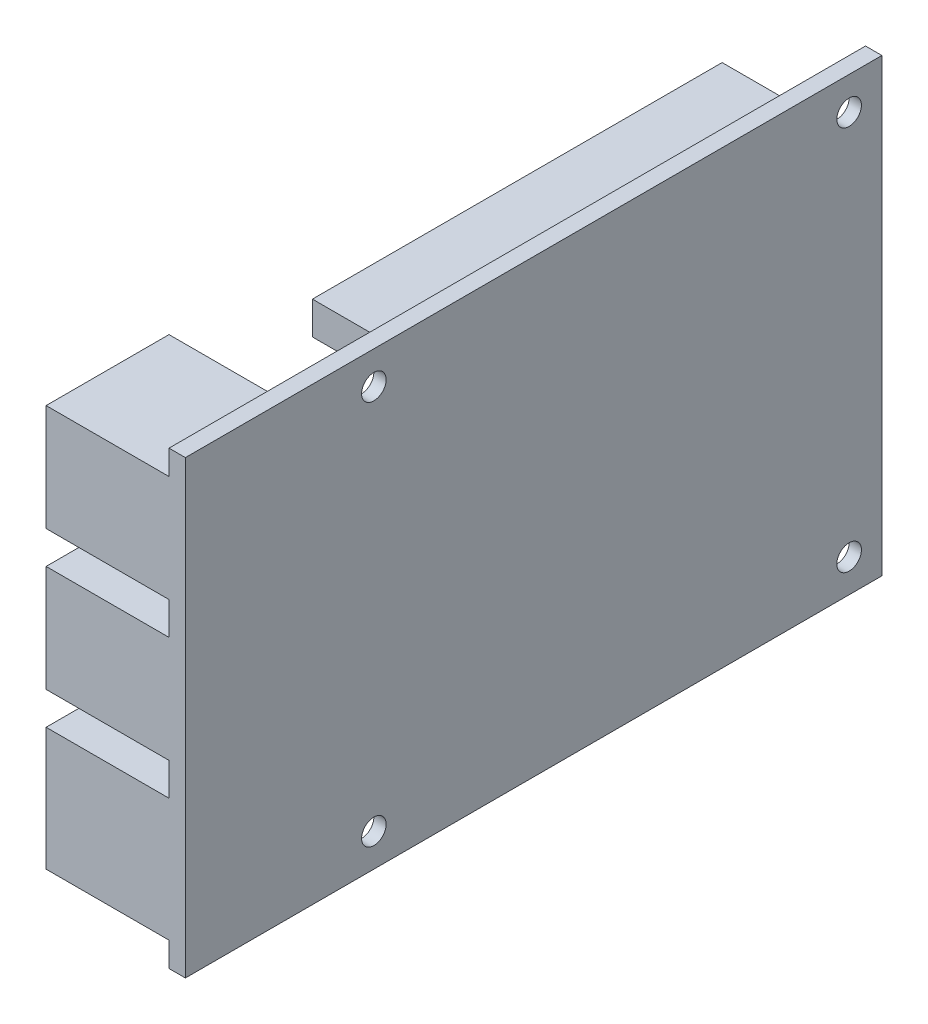
ISO-10303-21;
HEADER;
FILE_DESCRIPTION(('STEP AP214'),'2;1');
FILE_NAME('part.step','',(''),(''),'','','');
FILE_SCHEMA(('AUTOMOTIVE_DESIGN { 1 0 10303 214 1 1 1 1 }'));
ENDSEC;
DATA;
#1=APPLICATION_CONTEXT('core data for automotive mechanical design processes');
#2=APPLICATION_PROTOCOL_DEFINITION('international standard','automotive_design',2000,#1);
#3=PRODUCT_CONTEXT('',#1,'mechanical');
#4=PRODUCT('Part','Part','',(#3));
#5=PRODUCT_RELATED_PRODUCT_CATEGORY('part','',(#4));
#6=PRODUCT_DEFINITION_FORMATION('','',#4);
#7=PRODUCT_DEFINITION_CONTEXT('part definition',#1,'design');
#8=PRODUCT_DEFINITION('design','',#6,#7);
#9=PRODUCT_DEFINITION_SHAPE('','',#8);
#10=(LENGTH_UNIT() NAMED_UNIT(*) SI_UNIT(.MILLI.,.METRE.));
#11=(NAMED_UNIT(*) PLANE_ANGLE_UNIT() SI_UNIT($,.RADIAN.));
#12=(NAMED_UNIT(*) SI_UNIT($,.STERADIAN.) SOLID_ANGLE_UNIT());
#13=UNCERTAINTY_MEASURE_WITH_UNIT(LENGTH_MEASURE(1.E-05),#10,'distance_accuracy_value','');
#14=(GEOMETRIC_REPRESENTATION_CONTEXT(3) GLOBAL_UNCERTAINTY_ASSIGNED_CONTEXT((#13)) GLOBAL_UNIT_ASSIGNED_CONTEXT((#10,
#11,#12)) REPRESENTATION_CONTEXT('',''));
#15=CARTESIAN_POINT('',(0.,0.,0.));
#16=DIRECTION('',(0.,0.,1.));
#17=DIRECTION('',(1.,0.,0.));
#18=AXIS2_PLACEMENT_3D('',#15,#16,#17);
#19=CARTESIAN_POINT('',(0.,0.,0.));
#20=DIRECTION('',(-1.,0.,0.));
#21=DIRECTION('',(0.,0.,1.));
#22=AXIS2_PLACEMENT_3D('',#19,#20,#21);
#23=PLANE('',#22);
#24=CARTESIAN_POINT('',(0.,-23.5,19.5));
#25=DIRECTION('',(-1.,0.,0.));
#26=DIRECTION('',(0.,0.,-1.));
#27=AXIS2_PLACEMENT_3D('',#24,#25,#26);
#28=CIRCLE('',#27,2.5);
#29=CARTESIAN_POINT('',(0.,-23.5,17.));
#30=VERTEX_POINT('',#29);
#31=EDGE_CURVE('E197',#30,#30,#28,.T.);
#32=ORIENTED_EDGE('',*,*,#31,.F.);
#33=EDGE_LOOP('',(#32));
#34=FACE_BOUND('',#33,.T.);
#35=CARTESIAN_POINT('',(0.,-23.5,-38.5));
#36=DIRECTION('',(-1.,0.,0.));
#37=DIRECTION('',(0.,0.,-1.));
#38=AXIS2_PLACEMENT_3D('',#35,#36,#37);
#39=CIRCLE('',#38,2.5);
#40=CARTESIAN_POINT('',(0.,-23.5,-41.));
#41=VERTEX_POINT('',#40);
#42=EDGE_CURVE('E215',#41,#41,#39,.T.);
#43=ORIENTED_EDGE('',*,*,#42,.F.);
#44=EDGE_LOOP('',(#43));
#45=FACE_BOUND('',#44,.T.);
#46=CARTESIAN_POINT('',(0.,23.5,-38.5));
#47=DIRECTION('',(-1.,0.,0.));
#48=DIRECTION('',(0.,0.,1.));
#49=AXIS2_PLACEMENT_3D('',#46,#47,#48);
#50=CIRCLE('',#49,2.5);
#51=CARTESIAN_POINT('',(0.,23.5,-36.));
#52=VERTEX_POINT('',#51);
#53=EDGE_CURVE('E209',#52,#52,#50,.T.);
#54=ORIENTED_EDGE('',*,*,#53,.F.);
#55=EDGE_LOOP('',(#54));
#56=FACE_BOUND('',#55,.T.);
#57=CARTESIAN_POINT('',(0.,23.5,19.5));
#58=DIRECTION('',(-1.,0.,0.));
#59=DIRECTION('',(0.,0.,1.));
#60=AXIS2_PLACEMENT_3D('',#57,#58,#59);
#61=CIRCLE('',#60,2.5);
#62=CARTESIAN_POINT('',(0.,23.5,22.));
#63=VERTEX_POINT('',#62);
#64=EDGE_CURVE('E208',#63,#63,#61,.T.);
#65=ORIENTED_EDGE('',*,*,#64,.F.);
#66=EDGE_LOOP('',(#65));
#67=FACE_BOUND('',#66,.T.);
#68=DIRECTION('',(0.,1.,0.));
#69=VECTOR('',#68,1.);
#70=CARTESIAN_POINT('',(0.,11.5,27.5));
#71=LINE('',#70,#69);
#72=CARTESIAN_POINT('',(0.,11.5,27.5));
#73=VERTEX_POINT('',#72);
#74=CARTESIAN_POINT('',(0.,24.5,27.5));
#75=VERTEX_POINT('',#74);
#76=EDGE_CURVE('E237',#73,#75,#71,.T.);
#77=ORIENTED_EDGE('',*,*,#76,.T.);
#78=DIRECTION('',(0.,0.,-1.));
#79=VECTOR('',#78,1.);
#80=CARTESIAN_POINT('',(0.,24.5,42.5));
#81=LINE('',#80,#79);
#82=CARTESIAN_POINT('',(0.,24.5,42.5));
#83=VERTEX_POINT('',#82);
#84=EDGE_CURVE('E241',#83,#75,#81,.T.);
#85=ORIENTED_EDGE('',*,*,#84,.F.);
#86=DIRECTION('',(0.,-1.,0.));
#87=VECTOR('',#86,1.);
#88=CARTESIAN_POINT('',(0.,-27.5,42.5));
#89=LINE('',#88,#87);
#90=CARTESIAN_POINT('',(0.,27.5,42.5));
#91=VERTEX_POINT('',#90);
#92=EDGE_CURVE('E326',#91,#83,#89,.T.);
#93=ORIENTED_EDGE('',*,*,#92,.F.);
#94=DIRECTION('',(0.,0.,1.));
#95=VECTOR('',#94,1.);
#96=CARTESIAN_POINT('',(0.,27.5,42.5));
#97=LINE('',#96,#95);
#98=CARTESIAN_POINT('',(0.,27.5,-42.5));
#99=VERTEX_POINT('',#98);
#100=EDGE_CURVE('E323',#99,#91,#97,.T.);
#101=ORIENTED_EDGE('',*,*,#100,.F.);
#102=DIRECTION('',(0.,1.,0.));
#103=VECTOR('',#102,1.);
#104=CARTESIAN_POINT('',(0.,-27.5,-42.5));
#105=LINE('',#104,#103);
#106=CARTESIAN_POINT('',(0.,-27.5,-42.5));
#107=VERTEX_POINT('',#106);
#108=EDGE_CURVE('E309',#107,#99,#105,.T.);
#109=ORIENTED_EDGE('',*,*,#108,.F.);
#110=DIRECTION('',(0.,0.,-1.));
#111=VECTOR('',#110,1.);
#112=CARTESIAN_POINT('',(0.,-27.5,42.5));
#113=LINE('',#112,#111);
#114=CARTESIAN_POINT('',(0.,-27.5,42.5));
#115=VERTEX_POINT('',#114);
#116=EDGE_CURVE('E314',#115,#107,#113,.T.);
#117=ORIENTED_EDGE('',*,*,#116,.F.);
#118=CARTESIAN_POINT('',(0.,-24.5,42.5));
#119=VERTEX_POINT('',#118);
#120=EDGE_CURVE('E325',#119,#115,#89,.T.);
#121=ORIENTED_EDGE('',*,*,#120,.F.);
#122=DIRECTION('',(0.,0.,-1.));
#123=VECTOR('',#122,1.);
#124=CARTESIAN_POINT('',(0.,-24.5,42.5));
#125=LINE('',#124,#123);
#126=CARTESIAN_POINT('',(0.,-24.5,22.5));
#127=VERTEX_POINT('',#126);
#128=EDGE_CURVE('E285',#119,#127,#125,.T.);
#129=ORIENTED_EDGE('',*,*,#128,.T.);
#130=DIRECTION('',(0.,1.,0.));
#131=VECTOR('',#130,1.);
#132=CARTESIAN_POINT('',(0.,-24.5,22.5));
#133=LINE('',#132,#131);
#134=CARTESIAN_POINT('',(0.,-9.5,22.5));
#135=VERTEX_POINT('',#134);
#136=EDGE_CURVE('E295',#127,#135,#133,.T.);
#137=ORIENTED_EDGE('',*,*,#136,.T.);
#138=DIRECTION('',(0.,0.,-1.));
#139=VECTOR('',#138,1.);
#140=CARTESIAN_POINT('',(0.,-9.5,42.5));
#141=LINE('',#140,#139);
#142=CARTESIAN_POINT('',(0.,-9.5,42.5));
#143=VERTEX_POINT('',#142);
#144=EDGE_CURVE('E273',#143,#135,#141,.T.);
#145=ORIENTED_EDGE('',*,*,#144,.F.);
#146=CARTESIAN_POINT('',(0.,-5.5,42.5));
#147=VERTEX_POINT('',#146);
#148=EDGE_CURVE('E465',#147,#143,#89,.T.);
#149=ORIENTED_EDGE('',*,*,#148,.F.);
#150=DIRECTION('',(0.,0.,-1.));
#151=VECTOR('',#150,1.);
#152=CARTESIAN_POINT('',(0.,-5.5,42.5));
#153=LINE('',#152,#151);
#154=CARTESIAN_POINT('',(0.,-5.5,27.5));
#155=VERTEX_POINT('',#154);
#156=EDGE_CURVE('E263',#147,#155,#153,.T.);
#157=ORIENTED_EDGE('',*,*,#156,.T.);
#158=DIRECTION('',(0.,1.,0.));
#159=VECTOR('',#158,1.);
#160=CARTESIAN_POINT('',(0.,-5.5,27.5));
#161=LINE('',#160,#159);
#162=CARTESIAN_POINT('',(0.,7.5,27.5));
#163=VERTEX_POINT('',#162);
#164=EDGE_CURVE('E266',#155,#163,#161,.T.);
#165=ORIENTED_EDGE('',*,*,#164,.T.);
#166=DIRECTION('',(0.,0.,-1.));
#167=VECTOR('',#166,1.);
#168=CARTESIAN_POINT('',(0.,7.5,42.5));
#169=LINE('',#168,#167);
#170=CARTESIAN_POINT('',(0.,7.5,42.5));
#171=VERTEX_POINT('',#170);
#172=EDGE_CURVE('E270',#171,#163,#169,.T.);
#173=ORIENTED_EDGE('',*,*,#172,.F.);
#174=CARTESIAN_POINT('',(0.,11.5,42.5));
#175=VERTEX_POINT('',#174);
#176=EDGE_CURVE('E329',#175,#171,#89,.T.);
#177=ORIENTED_EDGE('',*,*,#176,.F.);
#178=DIRECTION('',(0.,0.,-1.));
#179=VECTOR('',#178,1.);
#180=CARTESIAN_POINT('',(0.,11.5,42.5));
#181=LINE('',#180,#179);
#182=EDGE_CURVE('E58',#175,#73,#181,.T.);
#183=ORIENTED_EDGE('',*,*,#182,.T.);
#184=EDGE_LOOP('',(#77,#85,#93,#101,#109,#117,#121,#129,#137,#145,#149,#157,#165,#173,#177,#183));
#185=FACE_BOUND('',#184,.T.);
#186=DIRECTION('',(0.,0.,-1.));
#187=VECTOR('',#186,1.);
#188=CARTESIAN_POINT('',(0.,25.5,16.));
#189=LINE('',#188,#187);
#190=CARTESIAN_POINT('',(0.,25.5,16.));
#191=VERTEX_POINT('',#190);
#192=CARTESIAN_POINT('',(0.,25.5,-34.));
#193=VERTEX_POINT('',#192);
#194=EDGE_CURVE('E489',#191,#193,#189,.T.);
#195=ORIENTED_EDGE('',*,*,#194,.F.);
#196=DIRECTION('',(0.,1.,0.));
#197=VECTOR('',#196,1.);
#198=CARTESIAN_POINT('',(0.,21.5,16.));
#199=LINE('',#198,#197);
#200=CARTESIAN_POINT('',(0.,21.5,16.));
#201=VERTEX_POINT('',#200);
#202=EDGE_CURVE('E195',#201,#191,#199,.T.);
#203=ORIENTED_EDGE('',*,*,#202,.F.);
#204=DIRECTION('',(0.,0.,1.));
#205=VECTOR('',#204,1.);
#206=CARTESIAN_POINT('',(0.,21.5,16.));
#207=LINE('',#206,#205);
#208=CARTESIAN_POINT('',(0.,21.5,-34.));
#209=VERTEX_POINT('',#208);
#210=EDGE_CURVE('E191',#209,#201,#207,.T.);
#211=ORIENTED_EDGE('',*,*,#210,.F.);
#212=DIRECTION('',(0.,-1.,0.));
#213=VECTOR('',#212,1.);
#214=CARTESIAN_POINT('',(0.,21.5,-34.));
#215=LINE('',#214,#213);
#216=EDGE_CURVE('E491',#193,#209,#215,.T.);
#217=ORIENTED_EDGE('',*,*,#216,.F.);
#218=EDGE_LOOP('',(#195,#203,#211,#217));
#219=FACE_BOUND('',#218,.T.);
#220=ADVANCED_FACE('F33',(#34,#45,#56,#67,#185,#219),#23,.T.);
#221=CARTESIAN_POINT('',(15.,23.5,-38.5));
#222=DIRECTION('',(-1.,0.,0.));
#223=DIRECTION('',(0.,0.,1.));
#224=AXIS2_PLACEMENT_3D('',#221,#222,#223);
#225=CYLINDRICAL_SURFACE('',#224,1.5);
#226=CARTESIAN_POINT('',(2.,23.5,-38.5));
#227=DIRECTION('',(-1.,0.,0.));
#228=DIRECTION('',(0.,0.,1.));
#229=AXIS2_PLACEMENT_3D('',#226,#227,#228);
#230=CIRCLE('',#229,1.5);
#231=CARTESIAN_POINT('',(2.,23.5,-37.));
#232=VERTEX_POINT('',#231);
#233=EDGE_CURVE('E338',#232,#232,#230,.T.);
#234=ORIENTED_EDGE('',*,*,#233,.F.);
#235=EDGE_LOOP('',(#234));
#236=FACE_BOUND('',#235,.T.);
#237=CARTESIAN_POINT('',(0.5,23.5,-38.5));
#238=DIRECTION('',(-1.,0.,0.));
#239=DIRECTION('',(0.,0.,1.));
#240=AXIS2_PLACEMENT_3D('',#237,#238,#239);
#241=CIRCLE('',#240,1.5);
#242=CARTESIAN_POINT('',(0.5,23.5,-37.));
#243=VERTEX_POINT('',#242);
#244=EDGE_CURVE('E37',#243,#243,#241,.F.);
#245=ORIENTED_EDGE('',*,*,#244,.F.);
#246=EDGE_LOOP('',(#245));
#247=FACE_BOUND('',#246,.T.);
#248=ADVANCED_FACE('F362',(#236,#247),#225,.F.);
#249=CARTESIAN_POINT('',(15.,23.5,19.5));
#250=DIRECTION('',(-1.,0.,0.));
#251=DIRECTION('',(0.,0.,1.));
#252=AXIS2_PLACEMENT_3D('',#249,#250,#251);
#253=CYLINDRICAL_SURFACE('',#252,1.5);
#254=CARTESIAN_POINT('',(2.,23.5,19.5));
#255=DIRECTION('',(-1.,0.,0.));
#256=DIRECTION('',(0.,0.,1.));
#257=AXIS2_PLACEMENT_3D('',#254,#255,#256);
#258=CIRCLE('',#257,1.5);
#259=CARTESIAN_POINT('',(2.,23.5,21.));
#260=VERTEX_POINT('',#259);
#261=EDGE_CURVE('E229',#260,#260,#258,.T.);
#262=ORIENTED_EDGE('',*,*,#261,.F.);
#263=EDGE_LOOP('',(#262));
#264=FACE_BOUND('',#263,.T.);
#265=CARTESIAN_POINT('',(0.5,23.5,19.5));
#266=DIRECTION('',(-1.,0.,0.));
#267=DIRECTION('',(0.,0.,1.));
#268=AXIS2_PLACEMENT_3D('',#265,#266,#267);
#269=CIRCLE('',#268,1.5);
#270=CARTESIAN_POINT('',(0.5,23.5,21.));
#271=VERTEX_POINT('',#270);
#272=EDGE_CURVE('E223',#271,#271,#269,.F.);
#273=ORIENTED_EDGE('',*,*,#272,.F.);
#274=EDGE_LOOP('',(#273));
#275=FACE_BOUND('',#274,.T.);
#276=ADVANCED_FACE('F364',(#264,#275),#253,.F.);
#277=CARTESIAN_POINT('',(2.,-27.5,-42.5));
#278=DIRECTION('',(0.,0.,1.));
#279=DIRECTION('',(1.,0.,0.));
#280=AXIS2_PLACEMENT_3D('',#277,#278,#279);
#281=PLANE('',#280);
#282=ORIENTED_EDGE('',*,*,#108,.T.);
#283=DIRECTION('',(-1.,0.,0.));
#284=VECTOR('',#283,1.);
#285=CARTESIAN_POINT('',(2.,27.5,-42.5));
#286=LINE('',#285,#284);
#287=CARTESIAN_POINT('',(2.,27.5,-42.5));
#288=VERTEX_POINT('',#287);
#289=EDGE_CURVE('E11',#288,#99,#286,.T.);
#290=ORIENTED_EDGE('',*,*,#289,.F.);
#291=DIRECTION('',(0.,1.,0.));
#292=VECTOR('',#291,1.);
#293=CARTESIAN_POINT('',(2.,-27.5,-42.5));
#294=LINE('',#293,#292);
#295=CARTESIAN_POINT('',(2.,-27.5,-42.5));
#296=VERTEX_POINT('',#295);
#297=EDGE_CURVE('E310',#296,#288,#294,.T.);
#298=ORIENTED_EDGE('',*,*,#297,.F.);
#299=DIRECTION('',(-1.,0.,0.));
#300=VECTOR('',#299,1.);
#301=CARTESIAN_POINT('',(2.,-27.5,-42.5));
#302=LINE('',#301,#300);
#303=EDGE_CURVE('E320',#296,#107,#302,.T.);
#304=ORIENTED_EDGE('',*,*,#303,.T.);
#305=EDGE_LOOP('',(#282,#290,#298,#304));
#306=FACE_BOUND('',#305,.T.);
#307=ADVANCED_FACE('F35',(#306),#281,.F.);
#308=CARTESIAN_POINT('',(2.,27.5,42.5));
#309=DIRECTION('',(0.,-1.,0.));
#310=DIRECTION('',(0.,0.,-1.));
#311=AXIS2_PLACEMENT_3D('',#308,#309,#310);
#312=PLANE('',#311);
#313=ORIENTED_EDGE('',*,*,#100,.T.);
#314=DIRECTION('',(-1.,0.,0.));
#315=VECTOR('',#314,1.);
#316=CARTESIAN_POINT('',(2.,27.5,42.5));
#317=LINE('',#316,#315);
#318=CARTESIAN_POINT('',(2.,27.5,42.5));
#319=VERTEX_POINT('',#318);
#320=EDGE_CURVE('E42',#319,#91,#317,.T.);
#321=ORIENTED_EDGE('',*,*,#320,.F.);
#322=DIRECTION('',(0.,0.,1.));
#323=VECTOR('',#322,1.);
#324=CARTESIAN_POINT('',(2.,27.5,42.5));
#325=LINE('',#324,#323);
#326=EDGE_CURVE('E313',#288,#319,#325,.T.);
#327=ORIENTED_EDGE('',*,*,#326,.F.);
#328=ORIENTED_EDGE('',*,*,#289,.T.);
#329=EDGE_LOOP('',(#313,#321,#327,#328));
#330=FACE_BOUND('',#329,.T.);
#331=ADVANCED_FACE('F438',(#330),#312,.F.);
#332=CARTESIAN_POINT('',(2.,-27.5,42.5));
#333=DIRECTION('',(0.,0.,-1.));
#334=DIRECTION('',(-1.,0.,0.));
#335=AXIS2_PLACEMENT_3D('',#332,#333,#334);
#336=PLANE('',#335);
#337=ORIENTED_EDGE('',*,*,#92,.T.);
#338=DIRECTION('',(1.,0.,0.));
#339=VECTOR('',#338,1.);
#340=CARTESIAN_POINT('',(-15.,24.5,42.5));
#341=LINE('',#340,#339);
#342=CARTESIAN_POINT('',(-15.,24.5,42.5));
#343=VERTEX_POINT('',#342);
#344=EDGE_CURVE('E233',#343,#83,#341,.T.);
#345=ORIENTED_EDGE('',*,*,#344,.F.);
#346=DIRECTION('',(0.,1.,0.));
#347=VECTOR('',#346,1.);
#348=CARTESIAN_POINT('',(-15.,11.5,42.5));
#349=LINE('',#348,#347);
#350=CARTESIAN_POINT('',(-15.,11.5,42.5));
#351=VERTEX_POINT('',#350);
#352=EDGE_CURVE('E235',#351,#343,#349,.T.);
#353=ORIENTED_EDGE('',*,*,#352,.F.);
#354=DIRECTION('',(1.,0.,0.));
#355=VECTOR('',#354,1.);
#356=CARTESIAN_POINT('',(-15.,11.5,42.5));
#357=LINE('',#356,#355);
#358=EDGE_CURVE('E231',#351,#175,#357,.T.);
#359=ORIENTED_EDGE('',*,*,#358,.T.);
#360=ORIENTED_EDGE('',*,*,#176,.T.);
#361=DIRECTION('',(1.,0.,0.));
#362=VECTOR('',#361,1.);
#363=CARTESIAN_POINT('',(-15.,7.5,42.5));
#364=LINE('',#363,#362);
#365=CARTESIAN_POINT('',(-15.,7.5,42.5));
#366=VERTEX_POINT('',#365);
#367=EDGE_CURVE('E259',#366,#171,#364,.T.);
#368=ORIENTED_EDGE('',*,*,#367,.F.);
#369=DIRECTION('',(0.,1.,0.));
#370=VECTOR('',#369,1.);
#371=CARTESIAN_POINT('',(-15.,-5.5,42.5));
#372=LINE('',#371,#370);
#373=CARTESIAN_POINT('',(-15.,-5.5,42.5));
#374=VERTEX_POINT('',#373);
#375=EDGE_CURVE('E262',#374,#366,#372,.T.);
#376=ORIENTED_EDGE('',*,*,#375,.F.);
#377=DIRECTION('',(1.,0.,0.));
#378=VECTOR('',#377,1.);
#379=CARTESIAN_POINT('',(-15.,-5.5,42.5));
#380=LINE('',#379,#378);
#381=EDGE_CURVE('E256',#374,#147,#380,.T.);
#382=ORIENTED_EDGE('',*,*,#381,.T.);
#383=ORIENTED_EDGE('',*,*,#148,.T.);
#384=DIRECTION('',(1.,0.,0.));
#385=VECTOR('',#384,1.);
#386=CARTESIAN_POINT('',(-15.,-9.5,42.5));
#387=LINE('',#386,#385);
#388=CARTESIAN_POINT('',(-15.,-9.5,42.5));
#389=VERTEX_POINT('',#388);
#390=EDGE_CURVE('E293',#389,#143,#387,.T.);
#391=ORIENTED_EDGE('',*,*,#390,.F.);
#392=DIRECTION('',(0.,1.,0.));
#393=VECTOR('',#392,1.);
#394=CARTESIAN_POINT('',(-15.,-24.5,42.5));
#395=LINE('',#394,#393);
#396=CARTESIAN_POINT('',(-15.,-24.5,42.5));
#397=VERTEX_POINT('',#396);
#398=EDGE_CURVE('E291',#397,#389,#395,.T.);
#399=ORIENTED_EDGE('',*,*,#398,.F.);
#400=DIRECTION('',(1.,0.,0.));
#401=VECTOR('',#400,1.);
#402=CARTESIAN_POINT('',(-15.,-24.5,42.5));
#403=LINE('',#402,#401);
#404=EDGE_CURVE('E302',#397,#119,#403,.T.);
#405=ORIENTED_EDGE('',*,*,#404,.T.);
#406=ORIENTED_EDGE('',*,*,#120,.T.);
#407=DIRECTION('',(-1.,0.,0.));
#408=VECTOR('',#407,1.);
#409=CARTESIAN_POINT('',(2.,-27.5,42.5));
#410=LINE('',#409,#408);
#411=CARTESIAN_POINT('',(2.,-27.5,42.5));
#412=VERTEX_POINT('',#411);
#413=EDGE_CURVE('E333',#412,#115,#410,.T.);
#414=ORIENTED_EDGE('',*,*,#413,.F.);
#415=DIRECTION('',(0.,-1.,0.));
#416=VECTOR('',#415,1.);
#417=CARTESIAN_POINT('',(2.,-27.5,42.5));
#418=LINE('',#417,#416);
#419=EDGE_CURVE('E316',#319,#412,#418,.T.);
#420=ORIENTED_EDGE('',*,*,#419,.F.);
#421=ORIENTED_EDGE('',*,*,#320,.T.);
#422=EDGE_LOOP('',(#337,#345,#353,#359,#360,#368,#376,#382,#383,#391,#399,#405,#406,#414,#420,#421));
#423=FACE_BOUND('',#422,.T.);
#424=ADVANCED_FACE('F435',(#423),#336,.F.);
#425=CARTESIAN_POINT('',(2.,-27.5,42.5));
#426=DIRECTION('',(0.,1.,0.));
#427=DIRECTION('',(0.,0.,1.));
#428=AXIS2_PLACEMENT_3D('',#425,#426,#427);
#429=PLANE('',#428);
#430=ORIENTED_EDGE('',*,*,#116,.T.);
#431=ORIENTED_EDGE('',*,*,#303,.F.);
#432=DIRECTION('',(0.,0.,-1.));
#433=VECTOR('',#432,1.);
#434=CARTESIAN_POINT('',(2.,-27.5,42.5));
#435=LINE('',#434,#433);
#436=EDGE_CURVE('E318',#412,#296,#435,.T.);
#437=ORIENTED_EDGE('',*,*,#436,.F.);
#438=ORIENTED_EDGE('',*,*,#413,.T.);
#439=EDGE_LOOP('',(#430,#431,#437,#438));
#440=FACE_BOUND('',#439,.T.);
#441=ADVANCED_FACE('F430',(#440),#429,.F.);
#442=CARTESIAN_POINT('',(2.,0.,0.));
#443=DIRECTION('',(-1.,0.,0.));
#444=DIRECTION('',(0.,0.,1.));
#445=AXIS2_PLACEMENT_3D('',#442,#443,#444);
#446=PLANE('',#445);
#447=ORIENTED_EDGE('',*,*,#261,.T.);
#448=EDGE_LOOP('',(#447));
#449=FACE_BOUND('',#448,.T.);
#450=CARTESIAN_POINT('',(2.,-23.5,-38.5));
#451=DIRECTION('',(-1.,0.,0.));
#452=DIRECTION('',(0.,0.,1.));
#453=AXIS2_PLACEMENT_3D('',#450,#451,#452);
#454=CIRCLE('',#453,1.5);
#455=CARTESIAN_POINT('',(2.,-23.5,-37.));
#456=VERTEX_POINT('',#455);
#457=EDGE_CURVE('E344',#456,#456,#454,.T.);
#458=ORIENTED_EDGE('',*,*,#457,.T.);
#459=EDGE_LOOP('',(#458));
#460=FACE_BOUND('',#459,.T.);
#461=CARTESIAN_POINT('',(2.,-23.5,19.5));
#462=DIRECTION('',(-1.,0.,0.));
#463=DIRECTION('',(0.,0.,1.));
#464=AXIS2_PLACEMENT_3D('',#461,#462,#463);
#465=CIRCLE('',#464,1.5);
#466=CARTESIAN_POINT('',(2.,-23.5,21.));
#467=VERTEX_POINT('',#466);
#468=EDGE_CURVE('E341',#467,#467,#465,.T.);
#469=ORIENTED_EDGE('',*,*,#468,.T.);
#470=EDGE_LOOP('',(#469));
#471=FACE_BOUND('',#470,.T.);
#472=ORIENTED_EDGE('',*,*,#233,.T.);
#473=EDGE_LOOP('',(#472));
#474=FACE_BOUND('',#473,.T.);
#475=ORIENTED_EDGE('',*,*,#297,.T.);
#476=ORIENTED_EDGE('',*,*,#326,.T.);
#477=ORIENTED_EDGE('',*,*,#419,.T.);
#478=ORIENTED_EDGE('',*,*,#436,.T.);
#479=EDGE_LOOP('',(#475,#476,#477,#478));
#480=FACE_BOUND('',#479,.T.);
#481=ADVANCED_FACE('F427',(#449,#460,#471,#474,#480),#446,.F.);
#482=CARTESIAN_POINT('',(-15.,-9.5,42.5));
#483=DIRECTION('',(0.,-1.,0.));
#484=DIRECTION('',(0.,0.,-1.));
#485=AXIS2_PLACEMENT_3D('',#482,#483,#484);
#486=PLANE('',#485);
#487=ORIENTED_EDGE('',*,*,#144,.T.);
#488=DIRECTION('',(1.,0.,0.));
#489=VECTOR('',#488,1.);
#490=CARTESIAN_POINT('',(-15.,-9.5,22.5));
#491=LINE('',#490,#489);
#492=CARTESIAN_POINT('',(-15.,-9.5,22.5));
#493=VERTEX_POINT('',#492);
#494=EDGE_CURVE('E306',#493,#135,#491,.T.);
#495=ORIENTED_EDGE('',*,*,#494,.F.);
#496=DIRECTION('',(0.,0.,-1.));
#497=VECTOR('',#496,1.);
#498=CARTESIAN_POINT('',(-15.,-9.5,42.5));
#499=LINE('',#498,#497);
#500=EDGE_CURVE('E282',#389,#493,#499,.T.);
#501=ORIENTED_EDGE('',*,*,#500,.F.);
#502=ORIENTED_EDGE('',*,*,#390,.T.);
#503=EDGE_LOOP('',(#487,#495,#501,#502));
#504=FACE_BOUND('',#503,.T.);
#505=ADVANCED_FACE('F423',(#504),#486,.F.);
#506=CARTESIAN_POINT('',(-15.,-24.5,22.5));
#507=DIRECTION('',(0.,0.,-1.));
#508=DIRECTION('',(0.,1.,0.));
#509=AXIS2_PLACEMENT_3D('',#506,#507,#508);
#510=PLANE('',#509);
#511=ORIENTED_EDGE('',*,*,#136,.F.);
#512=DIRECTION('',(1.,0.,0.));
#513=VECTOR('',#512,1.);
#514=CARTESIAN_POINT('',(-15.,-24.5,22.5));
#515=LINE('',#514,#513);
#516=CARTESIAN_POINT('',(-15.,-24.5,22.5));
#517=VERTEX_POINT('',#516);
#518=EDGE_CURVE('E304',#517,#127,#515,.T.);
#519=ORIENTED_EDGE('',*,*,#518,.F.);
#520=DIRECTION('',(0.,1.,0.));
#521=VECTOR('',#520,1.);
#522=CARTESIAN_POINT('',(-15.,-24.5,22.5));
#523=LINE('',#522,#521);
#524=EDGE_CURVE('E284',#517,#493,#523,.T.);
#525=ORIENTED_EDGE('',*,*,#524,.T.);
#526=ORIENTED_EDGE('',*,*,#494,.T.);
#527=EDGE_LOOP('',(#511,#519,#525,#526));
#528=FACE_BOUND('',#527,.T.);
#529=ADVANCED_FACE('F419',(#528),#510,.T.);
#530=CARTESIAN_POINT('',(-15.,-24.5,42.5));
#531=DIRECTION('',(0.,-1.,0.));
#532=DIRECTION('',(0.,0.,-1.));
#533=AXIS2_PLACEMENT_3D('',#530,#531,#532);
#534=PLANE('',#533);
#535=ORIENTED_EDGE('',*,*,#128,.F.);
#536=ORIENTED_EDGE('',*,*,#404,.F.);
#537=DIRECTION('',(0.,0.,-1.));
#538=VECTOR('',#537,1.);
#539=CARTESIAN_POINT('',(-15.,-24.5,42.5));
#540=LINE('',#539,#538);
#541=EDGE_CURVE('E288',#397,#517,#540,.T.);
#542=ORIENTED_EDGE('',*,*,#541,.T.);
#543=ORIENTED_EDGE('',*,*,#518,.T.);
#544=EDGE_LOOP('',(#535,#536,#542,#543));
#545=FACE_BOUND('',#544,.T.);
#546=ADVANCED_FACE('F415',(#545),#534,.T.);
#547=CARTESIAN_POINT('',(-15.,0.,0.));
#548=DIRECTION('',(1.,0.,0.));
#549=DIRECTION('',(0.,0.,-1.));
#550=AXIS2_PLACEMENT_3D('',#547,#548,#549);
#551=PLANE('',#550);
#552=ORIENTED_EDGE('',*,*,#500,.T.);
#553=ORIENTED_EDGE('',*,*,#524,.F.);
#554=ORIENTED_EDGE('',*,*,#541,.F.);
#555=ORIENTED_EDGE('',*,*,#398,.T.);
#556=EDGE_LOOP('',(#552,#553,#554,#555));
#557=FACE_BOUND('',#556,.T.);
#558=ADVANCED_FACE('F401',(#557),#551,.F.);
#559=CARTESIAN_POINT('',(-15.,7.5,42.5));
#560=DIRECTION('',(0.,-1.,0.));
#561=DIRECTION('',(0.,0.,-1.));
#562=AXIS2_PLACEMENT_3D('',#559,#560,#561);
#563=PLANE('',#562);
#564=ORIENTED_EDGE('',*,*,#172,.T.);
#565=DIRECTION('',(1.,0.,0.));
#566=VECTOR('',#565,1.);
#567=CARTESIAN_POINT('',(-15.,7.5,27.5));
#568=LINE('',#567,#566);
#569=CARTESIAN_POINT('',(-15.,7.5,27.5));
#570=VERTEX_POINT('',#569);
#571=EDGE_CURVE('E244',#570,#163,#568,.T.);
#572=ORIENTED_EDGE('',*,*,#571,.F.);
#573=DIRECTION('',(0.,0.,-1.));
#574=VECTOR('',#573,1.);
#575=CARTESIAN_POINT('',(-15.,7.5,42.5));
#576=LINE('',#575,#574);
#577=EDGE_CURVE('E267',#366,#570,#576,.T.);
#578=ORIENTED_EDGE('',*,*,#577,.F.);
#579=ORIENTED_EDGE('',*,*,#367,.T.);
#580=EDGE_LOOP('',(#564,#572,#578,#579));
#581=FACE_BOUND('',#580,.T.);
#582=ADVANCED_FACE('F397',(#581),#563,.F.);
#583=CARTESIAN_POINT('',(-15.,-5.5,27.5));
#584=DIRECTION('',(0.,0.,-1.));
#585=DIRECTION('',(-1.,0.,0.));
#586=AXIS2_PLACEMENT_3D('',#583,#584,#585);
#587=PLANE('',#586);
#588=ORIENTED_EDGE('',*,*,#164,.F.);
#589=DIRECTION('',(1.,0.,0.));
#590=VECTOR('',#589,1.);
#591=CARTESIAN_POINT('',(-15.,-5.5,27.5));
#592=LINE('',#591,#590);
#593=CARTESIAN_POINT('',(-15.,-5.5,27.5));
#594=VERTEX_POINT('',#593);
#595=EDGE_CURVE('E254',#594,#155,#592,.T.);
#596=ORIENTED_EDGE('',*,*,#595,.F.);
#597=DIRECTION('',(0.,1.,0.));
#598=VECTOR('',#597,1.);
#599=CARTESIAN_POINT('',(-15.,-5.5,27.5));
#600=LINE('',#599,#598);
#601=EDGE_CURVE('E278',#594,#570,#600,.T.);
#602=ORIENTED_EDGE('',*,*,#601,.T.);
#603=ORIENTED_EDGE('',*,*,#571,.T.);
#604=EDGE_LOOP('',(#588,#596,#602,#603));
#605=FACE_BOUND('',#604,.T.);
#606=ADVANCED_FACE('F400',(#605),#587,.T.);
#607=CARTESIAN_POINT('',(-15.,-5.5,42.5));
#608=DIRECTION('',(0.,-1.,0.));
#609=DIRECTION('',(0.,0.,-1.));
#610=AXIS2_PLACEMENT_3D('',#607,#608,#609);
#611=PLANE('',#610);
#612=ORIENTED_EDGE('',*,*,#156,.F.);
#613=ORIENTED_EDGE('',*,*,#381,.F.);
#614=DIRECTION('',(0.,0.,-1.));
#615=VECTOR('',#614,1.);
#616=CARTESIAN_POINT('',(-15.,-5.5,42.5));
#617=LINE('',#616,#615);
#618=EDGE_CURVE('E275',#374,#594,#617,.T.);
#619=ORIENTED_EDGE('',*,*,#618,.T.);
#620=ORIENTED_EDGE('',*,*,#595,.T.);
#621=EDGE_LOOP('',(#612,#613,#619,#620));
#622=FACE_BOUND('',#621,.T.);
#623=ADVANCED_FACE('F405',(#622),#611,.T.);
#624=CARTESIAN_POINT('',(-15.,0.,0.));
#625=DIRECTION('',(1.,0.,0.));
#626=DIRECTION('',(0.,0.,-1.));
#627=AXIS2_PLACEMENT_3D('',#624,#625,#626);
#628=PLANE('',#627);
#629=ORIENTED_EDGE('',*,*,#577,.T.);
#630=ORIENTED_EDGE('',*,*,#601,.F.);
#631=ORIENTED_EDGE('',*,*,#618,.F.);
#632=ORIENTED_EDGE('',*,*,#375,.T.);
#633=EDGE_LOOP('',(#629,#630,#631,#632));
#634=FACE_BOUND('',#633,.T.);
#635=ADVANCED_FACE('F384',(#634),#628,.F.);
#636=CARTESIAN_POINT('',(-15.,24.5,42.5));
#637=DIRECTION('',(0.,-1.,0.));
#638=DIRECTION('',(0.,0.,-1.));
#639=AXIS2_PLACEMENT_3D('',#636,#637,#638);
#640=PLANE('',#639);
#641=ORIENTED_EDGE('',*,*,#84,.T.);
#642=DIRECTION('',(1.,0.,0.));
#643=VECTOR('',#642,1.);
#644=CARTESIAN_POINT('',(-15.,24.5,27.5));
#645=LINE('',#644,#643);
#646=CARTESIAN_POINT('',(-15.,24.5,27.5));
#647=VERTEX_POINT('',#646);
#648=EDGE_CURVE('E226',#647,#75,#645,.T.);
#649=ORIENTED_EDGE('',*,*,#648,.F.);
#650=DIRECTION('',(0.,0.,-1.));
#651=VECTOR('',#650,1.);
#652=CARTESIAN_POINT('',(-15.,24.5,42.5));
#653=LINE('',#652,#651);
#654=EDGE_CURVE('E238',#343,#647,#653,.T.);
#655=ORIENTED_EDGE('',*,*,#654,.F.);
#656=ORIENTED_EDGE('',*,*,#344,.T.);
#657=EDGE_LOOP('',(#641,#649,#655,#656));
#658=FACE_BOUND('',#657,.T.);
#659=ADVANCED_FACE('F380',(#658),#640,.F.);
#660=CARTESIAN_POINT('',(-15.,11.5,27.5));
#661=DIRECTION('',(0.,0.,-1.));
#662=DIRECTION('',(0.,1.,0.));
#663=AXIS2_PLACEMENT_3D('',#660,#661,#662);
#664=PLANE('',#663);
#665=ORIENTED_EDGE('',*,*,#76,.F.);
#666=DIRECTION('',(1.,0.,0.));
#667=VECTOR('',#666,1.);
#668=CARTESIAN_POINT('',(-15.,11.5,27.5));
#669=LINE('',#668,#667);
#670=CARTESIAN_POINT('',(-15.,11.5,27.5));
#671=VERTEX_POINT('',#670);
#672=EDGE_CURVE('E228',#671,#73,#669,.T.);
#673=ORIENTED_EDGE('',*,*,#672,.F.);
#674=DIRECTION('',(0.,1.,0.));
#675=VECTOR('',#674,1.);
#676=CARTESIAN_POINT('',(-15.,11.5,27.5));
#677=LINE('',#676,#675);
#678=EDGE_CURVE('E249',#671,#647,#677,.T.);
#679=ORIENTED_EDGE('',*,*,#678,.T.);
#680=ORIENTED_EDGE('',*,*,#648,.T.);
#681=EDGE_LOOP('',(#665,#673,#679,#680));
#682=FACE_BOUND('',#681,.T.);
#683=ADVANCED_FACE('F383',(#682),#664,.T.);
#684=CARTESIAN_POINT('',(-15.,11.5,42.5));
#685=DIRECTION('',(0.,-1.,0.));
#686=DIRECTION('',(0.,0.,-1.));
#687=AXIS2_PLACEMENT_3D('',#684,#685,#686);
#688=PLANE('',#687);
#689=ORIENTED_EDGE('',*,*,#182,.F.);
#690=ORIENTED_EDGE('',*,*,#358,.F.);
#691=DIRECTION('',(0.,0.,-1.));
#692=VECTOR('',#691,1.);
#693=CARTESIAN_POINT('',(-15.,11.5,42.5));
#694=LINE('',#693,#692);
#695=EDGE_CURVE('E246',#351,#671,#694,.T.);
#696=ORIENTED_EDGE('',*,*,#695,.T.);
#697=ORIENTED_EDGE('',*,*,#672,.T.);
#698=EDGE_LOOP('',(#689,#690,#696,#697));
#699=FACE_BOUND('',#698,.T.);
#700=ADVANCED_FACE('F388',(#699),#688,.T.);
#701=CARTESIAN_POINT('',(-15.,0.,0.));
#702=DIRECTION('',(1.,0.,0.));
#703=DIRECTION('',(0.,0.,-1.));
#704=AXIS2_PLACEMENT_3D('',#701,#702,#703);
#705=PLANE('',#704);
#706=ORIENTED_EDGE('',*,*,#654,.T.);
#707=ORIENTED_EDGE('',*,*,#678,.F.);
#708=ORIENTED_EDGE('',*,*,#695,.F.);
#709=ORIENTED_EDGE('',*,*,#352,.T.);
#710=EDGE_LOOP('',(#706,#707,#708,#709));
#711=FACE_BOUND('',#710,.T.);
#712=ADVANCED_FACE('F392',(#711),#705,.F.);
#713=CARTESIAN_POINT('',(15.,-23.5,19.5));
#714=DIRECTION('',(-1.,0.,0.));
#715=DIRECTION('',(0.,0.,1.));
#716=AXIS2_PLACEMENT_3D('',#713,#714,#715);
#717=CYLINDRICAL_SURFACE('',#716,1.5);
#718=CARTESIAN_POINT('',(0.5,-23.5,19.5));
#719=DIRECTION('',(1.,0.,0.));
#720=DIRECTION('',(0.,0.,-1.));
#721=AXIS2_PLACEMENT_3D('',#718,#719,#720);
#722=CIRCLE('',#721,1.5);
#723=CARTESIAN_POINT('',(0.5,-23.5,18.));
#724=VERTEX_POINT('',#723);
#725=EDGE_CURVE('E353',#724,#724,#722,.F.);
#726=ORIENTED_EDGE('',*,*,#725,.T.);
#727=EDGE_LOOP('',(#726));
#728=FACE_BOUND('',#727,.T.);
#729=ORIENTED_EDGE('',*,*,#468,.F.);
#730=EDGE_LOOP('',(#729));
#731=FACE_BOUND('',#730,.T.);
#732=ADVANCED_FACE('F395',(#728,#731),#717,.F.);
#733=CARTESIAN_POINT('',(15.,-23.5,-38.5));
#734=DIRECTION('',(-1.,0.,0.));
#735=DIRECTION('',(0.,0.,1.));
#736=AXIS2_PLACEMENT_3D('',#733,#734,#735);
#737=CYLINDRICAL_SURFACE('',#736,1.5);
#738=CARTESIAN_POINT('',(0.5,-23.5,-38.5));
#739=DIRECTION('',(1.,0.,0.));
#740=DIRECTION('',(0.,0.,-1.));
#741=AXIS2_PLACEMENT_3D('',#738,#739,#740);
#742=CIRCLE('',#741,1.5);
#743=CARTESIAN_POINT('',(0.5,-23.5,-40.));
#744=VERTEX_POINT('',#743);
#745=EDGE_CURVE('E351',#744,#744,#742,.F.);
#746=ORIENTED_EDGE('',*,*,#745,.T.);
#747=EDGE_LOOP('',(#746));
#748=FACE_BOUND('',#747,.T.);
#749=ORIENTED_EDGE('',*,*,#457,.F.);
#750=EDGE_LOOP('',(#749));
#751=FACE_BOUND('',#750,.T.);
#752=ADVANCED_FACE('F379',(#748,#751),#737,.F.);
#753=CARTESIAN_POINT('',(0.5,23.5,19.5));
#754=DIRECTION('',(-1.,0.,0.));
#755=DIRECTION('',(0.,0.,1.));
#756=AXIS2_PLACEMENT_3D('',#753,#754,#755);
#757=PLANE('',#756);
#758=CARTESIAN_POINT('',(0.5,23.5,19.5));
#759=DIRECTION('',(-1.,0.,0.));
#760=DIRECTION('',(0.,0.,1.));
#761=AXIS2_PLACEMENT_3D('',#758,#759,#760);
#762=CIRCLE('',#761,2.5);
#763=CARTESIAN_POINT('',(0.5,23.5,22.));
#764=VERTEX_POINT('',#763);
#765=EDGE_CURVE('E220',#764,#764,#762,.T.);
#766=ORIENTED_EDGE('',*,*,#765,.T.);
#767=EDGE_LOOP('',(#766));
#768=FACE_BOUND('',#767,.T.);
#769=ORIENTED_EDGE('',*,*,#272,.T.);
#770=EDGE_LOOP('',(#769));
#771=FACE_BOUND('',#770,.T.);
#772=ADVANCED_FACE('F540',(#768,#771),#757,.T.);
#773=CARTESIAN_POINT('',(0.5,23.5,19.5));
#774=DIRECTION('',(-1.,0.,0.));
#775=DIRECTION('',(0.,0.,1.));
#776=AXIS2_PLACEMENT_3D('',#773,#774,#775);
#777=CYLINDRICAL_SURFACE('',#776,2.5);
#778=ORIENTED_EDGE('',*,*,#765,.F.);
#779=EDGE_LOOP('',(#778));
#780=FACE_BOUND('',#779,.T.);
#781=ORIENTED_EDGE('',*,*,#64,.T.);
#782=EDGE_LOOP('',(#781));
#783=FACE_BOUND('',#782,.T.);
#784=ADVANCED_FACE('F528',(#780,#783),#777,.F.);
#785=CARTESIAN_POINT('',(0.5,-23.5,-38.5));
#786=DIRECTION('',(1.,0.,0.));
#787=DIRECTION('',(0.,0.,-1.));
#788=AXIS2_PLACEMENT_3D('',#785,#786,#787);
#789=PLANE('',#788);
#790=CARTESIAN_POINT('',(0.5,-23.5,-38.5));
#791=DIRECTION('',(-1.,0.,0.));
#792=DIRECTION('',(0.,0.,-1.));
#793=AXIS2_PLACEMENT_3D('',#790,#791,#792);
#794=CIRCLE('',#793,2.5);
#795=CARTESIAN_POINT('',(0.5,-23.5,-41.));
#796=VERTEX_POINT('',#795);
#797=EDGE_CURVE('E212',#796,#796,#794,.T.);
#798=ORIENTED_EDGE('',*,*,#797,.T.);
#799=EDGE_LOOP('',(#798));
#800=FACE_BOUND('',#799,.T.);
#801=ORIENTED_EDGE('',*,*,#745,.F.);
#802=EDGE_LOOP('',(#801));
#803=FACE_BOUND('',#802,.T.);
#804=ADVANCED_FACE('F524',(#800,#803),#789,.F.);
#805=CARTESIAN_POINT('',(0.5,-23.5,-38.5));
#806=DIRECTION('',(-1.,0.,0.));
#807=DIRECTION('',(0.,0.,1.));
#808=AXIS2_PLACEMENT_3D('',#805,#806,#807);
#809=CYLINDRICAL_SURFACE('',#808,2.5);
#810=ORIENTED_EDGE('',*,*,#797,.F.);
#811=EDGE_LOOP('',(#810));
#812=FACE_BOUND('',#811,.T.);
#813=ORIENTED_EDGE('',*,*,#42,.T.);
#814=EDGE_LOOP('',(#813));
#815=FACE_BOUND('',#814,.T.);
#816=ADVANCED_FACE('F527',(#812,#815),#809,.F.);
#817=CARTESIAN_POINT('',(0.5,-23.5,19.5));
#818=DIRECTION('',(1.,0.,0.));
#819=DIRECTION('',(0.,0.,-1.));
#820=AXIS2_PLACEMENT_3D('',#817,#818,#819);
#821=PLANE('',#820);
#822=CARTESIAN_POINT('',(0.5,-23.5,19.5));
#823=DIRECTION('',(-1.,0.,0.));
#824=DIRECTION('',(0.,0.,-1.));
#825=AXIS2_PLACEMENT_3D('',#822,#823,#824);
#826=CIRCLE('',#825,2.5);
#827=CARTESIAN_POINT('',(0.5,-23.5,17.));
#828=VERTEX_POINT('',#827);
#829=EDGE_CURVE('E200',#828,#828,#826,.T.);
#830=ORIENTED_EDGE('',*,*,#829,.T.);
#831=EDGE_LOOP('',(#830));
#832=FACE_BOUND('',#831,.T.);
#833=ORIENTED_EDGE('',*,*,#725,.F.);
#834=EDGE_LOOP('',(#833));
#835=FACE_BOUND('',#834,.T.);
#836=ADVANCED_FACE('F532',(#832,#835),#821,.F.);
#837=CARTESIAN_POINT('',(0.5,-23.5,19.5));
#838=DIRECTION('',(-1.,0.,0.));
#839=DIRECTION('',(0.,0.,1.));
#840=AXIS2_PLACEMENT_3D('',#837,#838,#839);
#841=CYLINDRICAL_SURFACE('',#840,2.5);
#842=ORIENTED_EDGE('',*,*,#829,.F.);
#843=EDGE_LOOP('',(#842));
#844=FACE_BOUND('',#843,.T.);
#845=ORIENTED_EDGE('',*,*,#31,.T.);
#846=EDGE_LOOP('',(#845));
#847=FACE_BOUND('',#846,.T.);
#848=ADVANCED_FACE('F519',(#844,#847),#841,.F.);
#849=CARTESIAN_POINT('',(0.5,23.5,-38.5));
#850=DIRECTION('',(-1.,0.,0.));
#851=DIRECTION('',(0.,0.,1.));
#852=AXIS2_PLACEMENT_3D('',#849,#850,#851);
#853=PLANE('',#852);
#854=CARTESIAN_POINT('',(0.5,23.5,-38.5));
#855=DIRECTION('',(-1.,0.,0.));
#856=DIRECTION('',(0.,0.,1.));
#857=AXIS2_PLACEMENT_3D('',#854,#855,#856);
#858=CIRCLE('',#857,2.5);
#859=CARTESIAN_POINT('',(0.5,23.5,-36.));
#860=VERTEX_POINT('',#859);
#861=EDGE_CURVE('E205',#860,#860,#858,.T.);
#862=ORIENTED_EDGE('',*,*,#861,.T.);
#863=EDGE_LOOP('',(#862));
#864=FACE_BOUND('',#863,.T.);
#865=ORIENTED_EDGE('',*,*,#244,.T.);
#866=EDGE_LOOP('',(#865));
#867=FACE_BOUND('',#866,.T.);
#868=ADVANCED_FACE('F360',(#864,#867),#853,.T.);
#869=CARTESIAN_POINT('',(0.5,23.5,-38.5));
#870=DIRECTION('',(-1.,0.,0.));
#871=DIRECTION('',(0.,0.,1.));
#872=AXIS2_PLACEMENT_3D('',#869,#870,#871);
#873=CYLINDRICAL_SURFACE('',#872,2.5);
#874=ORIENTED_EDGE('',*,*,#861,.F.);
#875=EDGE_LOOP('',(#874));
#876=FACE_BOUND('',#875,.T.);
#877=ORIENTED_EDGE('',*,*,#53,.T.);
#878=EDGE_LOOP('',(#877));
#879=FACE_BOUND('',#878,.T.);
#880=ADVANCED_FACE('F516',(#876,#879),#873,.F.);
#881=CARTESIAN_POINT('',(-9.,21.5,16.));
#882=DIRECTION('',(0.,0.,-1.));
#883=DIRECTION('',(-1.,0.,0.));
#884=AXIS2_PLACEMENT_3D('',#881,#882,#883);
#885=PLANE('',#884);
#886=ORIENTED_EDGE('',*,*,#202,.T.);
#887=DIRECTION('',(1.,0.,0.));
#888=VECTOR('',#887,1.);
#889=CARTESIAN_POINT('',(-9.,25.5,16.));
#890=LINE('',#889,#888);
#891=CARTESIAN_POINT('',(-9.,25.5,16.));
#892=VERTEX_POINT('',#891);
#893=EDGE_CURVE('E176',#892,#191,#890,.T.);
#894=ORIENTED_EDGE('',*,*,#893,.F.);
#895=DIRECTION('',(0.,1.,0.));
#896=VECTOR('',#895,1.);
#897=CARTESIAN_POINT('',(-9.,21.5,16.));
#898=LINE('',#897,#896);
#899=CARTESIAN_POINT('',(-9.,21.5,16.));
#900=VERTEX_POINT('',#899);
#901=EDGE_CURVE('E183',#900,#892,#898,.T.);
#902=ORIENTED_EDGE('',*,*,#901,.F.);
#903=DIRECTION('',(1.,0.,0.));
#904=VECTOR('',#903,1.);
#905=CARTESIAN_POINT('',(-9.,21.5,16.));
#906=LINE('',#905,#904);
#907=EDGE_CURVE('E498',#900,#201,#906,.T.);
#908=ORIENTED_EDGE('',*,*,#907,.T.);
#909=EDGE_LOOP('',(#886,#894,#902,#908));
#910=FACE_BOUND('',#909,.T.);
#911=ADVANCED_FACE('F193',(#910),#885,.F.);
#912=CARTESIAN_POINT('',(-9.,25.5,16.));
#913=DIRECTION('',(0.,-1.,0.));
#914=DIRECTION('',(0.,0.,-1.));
#915=AXIS2_PLACEMENT_3D('',#912,#913,#914);
#916=PLANE('',#915);
#917=ORIENTED_EDGE('',*,*,#194,.T.);
#918=DIRECTION('',(1.,0.,0.));
#919=VECTOR('',#918,1.);
#920=CARTESIAN_POINT('',(-9.,25.5,-34.));
#921=LINE('',#920,#919);
#922=CARTESIAN_POINT('',(-9.,25.5,-34.));
#923=VERTEX_POINT('',#922);
#924=EDGE_CURVE('E179',#923,#193,#921,.T.);
#925=ORIENTED_EDGE('',*,*,#924,.F.);
#926=DIRECTION('',(0.,0.,-1.));
#927=VECTOR('',#926,1.);
#928=CARTESIAN_POINT('',(-9.,25.5,16.));
#929=LINE('',#928,#927);
#930=EDGE_CURVE('E172',#892,#923,#929,.T.);
#931=ORIENTED_EDGE('',*,*,#930,.F.);
#932=ORIENTED_EDGE('',*,*,#893,.T.);
#933=EDGE_LOOP('',(#917,#925,#931,#932));
#934=FACE_BOUND('',#933,.T.);
#935=ADVANCED_FACE('F174',(#934),#916,.F.);
#936=CARTESIAN_POINT('',(-9.,21.5,-34.));
#937=DIRECTION('',(0.,0.,1.));
#938=DIRECTION('',(1.,0.,0.));
#939=AXIS2_PLACEMENT_3D('',#936,#937,#938);
#940=PLANE('',#939);
#941=ORIENTED_EDGE('',*,*,#216,.T.);
#942=DIRECTION('',(1.,0.,0.));
#943=VECTOR('',#942,1.);
#944=CARTESIAN_POINT('',(-9.,21.5,-34.));
#945=LINE('',#944,#943);
#946=CARTESIAN_POINT('',(-9.,21.5,-34.));
#947=VERTEX_POINT('',#946);
#948=EDGE_CURVE('E50',#947,#209,#945,.T.);
#949=ORIENTED_EDGE('',*,*,#948,.F.);
#950=DIRECTION('',(0.,-1.,0.));
#951=VECTOR('',#950,1.);
#952=CARTESIAN_POINT('',(-9.,21.5,-34.));
#953=LINE('',#952,#951);
#954=EDGE_CURVE('E182',#923,#947,#953,.T.);
#955=ORIENTED_EDGE('',*,*,#954,.F.);
#956=ORIENTED_EDGE('',*,*,#924,.T.);
#957=EDGE_LOOP('',(#941,#949,#955,#956));
#958=FACE_BOUND('',#957,.T.);
#959=ADVANCED_FACE('F501',(#958),#940,.F.);
#960=CARTESIAN_POINT('',(-9.,21.5,16.));
#961=DIRECTION('',(0.,1.,0.));
#962=DIRECTION('',(0.,0.,1.));
#963=AXIS2_PLACEMENT_3D('',#960,#961,#962);
#964=PLANE('',#963);
#965=ORIENTED_EDGE('',*,*,#210,.T.);
#966=ORIENTED_EDGE('',*,*,#907,.F.);
#967=DIRECTION('',(0.,0.,1.));
#968=VECTOR('',#967,1.);
#969=CARTESIAN_POINT('',(-9.,21.5,16.));
#970=LINE('',#969,#968);
#971=EDGE_CURVE('E187',#947,#900,#970,.T.);
#972=ORIENTED_EDGE('',*,*,#971,.F.);
#973=ORIENTED_EDGE('',*,*,#948,.T.);
#974=EDGE_LOOP('',(#965,#966,#972,#973));
#975=FACE_BOUND('',#974,.T.);
#976=ADVANCED_FACE('F502',(#975),#964,.F.);
#977=CARTESIAN_POINT('',(-9.,0.,0.));
#978=DIRECTION('',(-1.,0.,0.));
#979=DIRECTION('',(0.,0.,1.));
#980=AXIS2_PLACEMENT_3D('',#977,#978,#979);
#981=PLANE('',#980);
#982=ORIENTED_EDGE('',*,*,#901,.T.);
#983=ORIENTED_EDGE('',*,*,#930,.T.);
#984=ORIENTED_EDGE('',*,*,#954,.T.);
#985=ORIENTED_EDGE('',*,*,#971,.T.);
#986=EDGE_LOOP('',(#982,#983,#984,#985));
#987=FACE_BOUND('',#986,.T.);
#988=ADVANCED_FACE('F186',(#987),#981,.T.);
#989=CLOSED_SHELL('',(#220,#248,#276,#307,#331,#424,#441,#481,#505,#529,#546,#558,#582,#606,
#623,#635,#659,#683,#700,#712,#732,#752,#772,#784,#804,#816,#836,#848,#868,#880,#911,#935,#959,
#976,#988));
#990=MANIFOLD_SOLID_BREP('B2',#989);
#991=ADVANCED_BREP_SHAPE_REPRESENTATION('',(#18,#990),#14);
#992=SHAPE_DEFINITION_REPRESENTATION(#9,#991);
ENDSEC;
END-ISO-10303-21;
